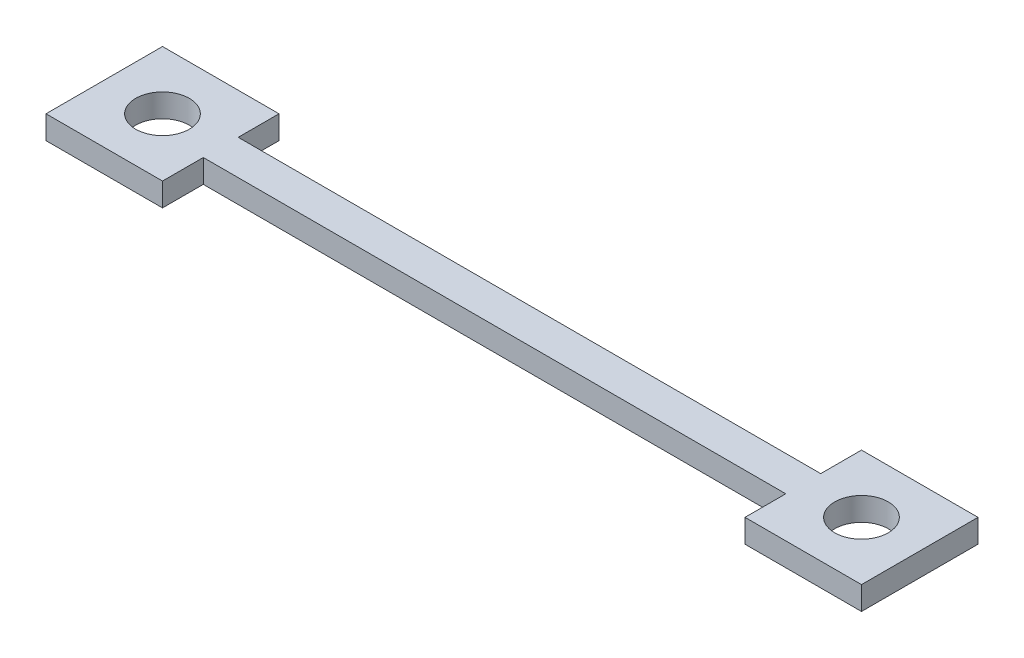
ISO-10303-21;
HEADER;
FILE_DESCRIPTION(('STEP AP214'),'2;1');
FILE_NAME('part.step','',(''),(''),'','','');
FILE_SCHEMA(('AUTOMOTIVE_DESIGN { 1 0 10303 214 1 1 1 1 }'));
ENDSEC;
DATA;
#1=APPLICATION_CONTEXT('core data for automotive mechanical design processes');
#2=APPLICATION_PROTOCOL_DEFINITION('international standard','automotive_design',2000,#1);
#3=PRODUCT_CONTEXT('',#1,'mechanical');
#4=PRODUCT('Part','Part','',(#3));
#5=PRODUCT_RELATED_PRODUCT_CATEGORY('part','',(#4));
#6=PRODUCT_DEFINITION_FORMATION('','',#4);
#7=PRODUCT_DEFINITION_CONTEXT('part definition',#1,'design');
#8=PRODUCT_DEFINITION('design','',#6,#7);
#9=PRODUCT_DEFINITION_SHAPE('','',#8);
#10=(LENGTH_UNIT() NAMED_UNIT(*) SI_UNIT(.MILLI.,.METRE.));
#11=(NAMED_UNIT(*) PLANE_ANGLE_UNIT() SI_UNIT($,.RADIAN.));
#12=(NAMED_UNIT(*) SI_UNIT($,.STERADIAN.) SOLID_ANGLE_UNIT());
#13=UNCERTAINTY_MEASURE_WITH_UNIT(LENGTH_MEASURE(1.E-05),#10,'distance_accuracy_value','');
#14=(GEOMETRIC_REPRESENTATION_CONTEXT(3) GLOBAL_UNCERTAINTY_ASSIGNED_CONTEXT((#13)) GLOBAL_UNIT_ASSIGNED_CONTEXT((#10,
#11,#12)) REPRESENTATION_CONTEXT('',''));
#15=CARTESIAN_POINT('',(0.,0.,0.));
#16=DIRECTION('',(0.,0.,1.));
#17=DIRECTION('',(1.,0.,0.));
#18=AXIS2_PLACEMENT_3D('',#15,#16,#17);
#19=CARTESIAN_POINT('',(-9.67404648456241,0.635,6.15575946530759));
#20=DIRECTION('',(0.,0.,1.));
#21=DIRECTION('',(1.,0.,0.));
#22=AXIS2_PLACEMENT_3D('',#19,#20,#21);
#23=PLANE('',#22);
#24=DIRECTION('',(-1.,0.,0.));
#25=VECTOR('',#24,1.);
#26=CARTESIAN_POINT('',(-9.67404648456241,-0.635,6.15575946530759));
#27=LINE('',#26,#25);
#28=CARTESIAN_POINT('',(-3.32404648456241,-0.635,6.15575946530759));
#29=VERTEX_POINT('',#28);
#30=CARTESIAN_POINT('',(-9.67404648456241,-0.635,6.15575946530759));
#31=VERTEX_POINT('',#30);
#32=EDGE_CURVE('E156',#29,#31,#27,.T.);
#33=ORIENTED_EDGE('',*,*,#32,.T.);
#34=DIRECTION('',(0.,-1.,0.));
#35=VECTOR('',#34,1.);
#36=CARTESIAN_POINT('',(-9.67404648456241,0.635,6.15575946530759));
#37=LINE('',#36,#35);
#38=CARTESIAN_POINT('',(-9.67404648456241,0.635,6.15575946530759));
#39=VERTEX_POINT('',#38);
#40=EDGE_CURVE('E11',#39,#31,#37,.T.);
#41=ORIENTED_EDGE('',*,*,#40,.F.);
#42=DIRECTION('',(-1.,0.,0.));
#43=VECTOR('',#42,1.);
#44=CARTESIAN_POINT('',(-9.67404648456241,0.635,6.15575946530759));
#45=LINE('',#44,#43);
#46=CARTESIAN_POINT('',(-3.32404648456241,0.635,6.15575946530759));
#47=VERTEX_POINT('',#46);
#48=EDGE_CURVE('E179',#47,#39,#45,.T.);
#49=ORIENTED_EDGE('',*,*,#48,.F.);
#50=DIRECTION('',(0.,-1.,0.));
#51=VECTOR('',#50,1.);
#52=CARTESIAN_POINT('',(-3.32404648456241,0.635,6.15575946530759));
#53=LINE('',#52,#51);
#54=EDGE_CURVE('E152',#47,#29,#53,.T.);
#55=ORIENTED_EDGE('',*,*,#54,.T.);
#56=EDGE_LOOP('',(#33,#41,#49,#55));
#57=FACE_BOUND('',#56,.T.);
#58=ADVANCED_FACE('F36',(#57),#23,.F.);
#59=CARTESIAN_POINT('',(-9.67404648456241,0.635,8.37825946530759));
#60=DIRECTION('',(1.,0.,0.));
#61=DIRECTION('',(0.,0.,-1.));
#62=AXIS2_PLACEMENT_3D('',#59,#60,#61);
#63=PLANE('',#62);
#64=DIRECTION('',(0.,0.,1.));
#65=VECTOR('',#64,1.);
#66=CARTESIAN_POINT('',(-9.67404648456241,-0.635,8.37825946530759));
#67=LINE('',#66,#65);
#68=CARTESIAN_POINT('',(-9.67404648456241,-0.635,8.37825946530759));
#69=VERTEX_POINT('',#68);
#70=EDGE_CURVE('E159',#31,#69,#67,.T.);
#71=ORIENTED_EDGE('',*,*,#70,.T.);
#72=DIRECTION('',(0.,-1.,0.));
#73=VECTOR('',#72,1.);
#74=CARTESIAN_POINT('',(-9.67404648456241,0.635,8.37825946530759));
#75=LINE('',#74,#73);
#76=CARTESIAN_POINT('',(-9.67404648456241,0.635,8.37825946530759));
#77=VERTEX_POINT('',#76);
#78=EDGE_CURVE('E44',#77,#69,#75,.T.);
#79=ORIENTED_EDGE('',*,*,#78,.F.);
#80=DIRECTION('',(0.,0.,1.));
#81=VECTOR('',#80,1.);
#82=CARTESIAN_POINT('',(-9.67404648456241,0.635,8.37825946530759));
#83=LINE('',#82,#81);
#84=EDGE_CURVE('E107',#39,#77,#83,.T.);
#85=ORIENTED_EDGE('',*,*,#84,.F.);
#86=ORIENTED_EDGE('',*,*,#40,.T.);
#87=EDGE_LOOP('',(#71,#79,#85,#86));
#88=FACE_BOUND('',#87,.T.);
#89=ADVANCED_FACE('F258',(#88),#63,.F.);
#90=CARTESIAN_POINT('',(-41.4240464845624,0.635,8.37825946530759));
#91=DIRECTION('',(0.,0.,1.));
#92=DIRECTION('',(1.,0.,0.));
#93=AXIS2_PLACEMENT_3D('',#90,#91,#92);
#94=PLANE('',#93);
#95=DIRECTION('',(-1.,0.,0.));
#96=VECTOR('',#95,1.);
#97=CARTESIAN_POINT('',(-41.4240464845624,-0.635,8.37825946530759));
#98=LINE('',#97,#96);
#99=CARTESIAN_POINT('',(-41.4240464845624,-0.635,8.37825946530759));
#100=VERTEX_POINT('',#99);
#101=EDGE_CURVE('E162',#69,#100,#98,.T.);
#102=ORIENTED_EDGE('',*,*,#101,.T.);
#103=DIRECTION('',(0.,-1.,0.));
#104=VECTOR('',#103,1.);
#105=CARTESIAN_POINT('',(-41.4240464845624,0.635,8.37825946530759));
#106=LINE('',#105,#104);
#107=CARTESIAN_POINT('',(-41.4240464845624,0.635,8.37825946530759));
#108=VERTEX_POINT('',#107);
#109=EDGE_CURVE('E198',#108,#100,#106,.T.);
#110=ORIENTED_EDGE('',*,*,#109,.F.);
#111=DIRECTION('',(-1.,0.,0.));
#112=VECTOR('',#111,1.);
#113=CARTESIAN_POINT('',(-41.4240464845624,0.635,8.37825946530759));
#114=LINE('',#113,#112);
#115=EDGE_CURVE('E206',#77,#108,#114,.T.);
#116=ORIENTED_EDGE('',*,*,#115,.F.);
#117=ORIENTED_EDGE('',*,*,#78,.T.);
#118=EDGE_LOOP('',(#102,#110,#116,#117));
#119=FACE_BOUND('',#118,.T.);
#120=ADVANCED_FACE('F204',(#119),#94,.F.);
#121=CARTESIAN_POINT('',(-41.4240464845624,0.635,8.37825946530759));
#122=DIRECTION('',(-1.,0.,0.));
#123=DIRECTION('',(0.,0.,1.));
#124=AXIS2_PLACEMENT_3D('',#121,#122,#123);
#125=PLANE('',#124);
#126=DIRECTION('',(0.,0.,-1.));
#127=VECTOR('',#126,1.);
#128=CARTESIAN_POINT('',(-41.4240464845624,-0.635,8.37825946530759));
#129=LINE('',#128,#127);
#130=CARTESIAN_POINT('',(-41.4240464845624,-0.635,6.15575946530758));
#131=VERTEX_POINT('',#130);
#132=EDGE_CURVE('E164',#100,#131,#129,.T.);
#133=ORIENTED_EDGE('',*,*,#132,.T.);
#134=DIRECTION('',(0.,-1.,0.));
#135=VECTOR('',#134,1.);
#136=CARTESIAN_POINT('',(-41.4240464845624,0.635,6.15575946530758));
#137=LINE('',#136,#135);
#138=CARTESIAN_POINT('',(-41.4240464845624,0.635,6.15575946530758));
#139=VERTEX_POINT('',#138);
#140=EDGE_CURVE('E195',#139,#131,#137,.T.);
#141=ORIENTED_EDGE('',*,*,#140,.F.);
#142=DIRECTION('',(0.,0.,-1.));
#143=VECTOR('',#142,1.);
#144=CARTESIAN_POINT('',(-41.4240464845624,0.635,8.37825946530759));
#145=LINE('',#144,#143);
#146=EDGE_CURVE('E224',#108,#139,#145,.T.);
#147=ORIENTED_EDGE('',*,*,#146,.F.);
#148=ORIENTED_EDGE('',*,*,#109,.T.);
#149=EDGE_LOOP('',(#133,#141,#147,#148));
#150=FACE_BOUND('',#149,.T.);
#151=ADVANCED_FACE('F215',(#150),#125,.F.);
#152=CARTESIAN_POINT('',(-47.7740464845624,0.635,6.15575946530758));
#153=DIRECTION('',(0.,0.,1.));
#154=DIRECTION('',(1.,0.,0.));
#155=AXIS2_PLACEMENT_3D('',#152,#153,#154);
#156=PLANE('',#155);
#157=DIRECTION('',(-1.,0.,0.));
#158=VECTOR('',#157,1.);
#159=CARTESIAN_POINT('',(-47.7740464845624,-0.635,6.15575946530758));
#160=LINE('',#159,#158);
#161=CARTESIAN_POINT('',(-47.7740464845624,-0.635,6.15575946530758));
#162=VERTEX_POINT('',#161);
#163=EDGE_CURVE('E166',#131,#162,#160,.T.);
#164=ORIENTED_EDGE('',*,*,#163,.T.);
#165=DIRECTION('',(0.,-1.,0.));
#166=VECTOR('',#165,1.);
#167=CARTESIAN_POINT('',(-47.7740464845624,0.635,6.15575946530758));
#168=LINE('',#167,#166);
#169=CARTESIAN_POINT('',(-47.7740464845624,0.635,6.15575946530758));
#170=VERTEX_POINT('',#169);
#171=EDGE_CURVE('E192',#170,#162,#168,.T.);
#172=ORIENTED_EDGE('',*,*,#171,.F.);
#173=DIRECTION('',(-1.,0.,0.));
#174=VECTOR('',#173,1.);
#175=CARTESIAN_POINT('',(-47.7740464845624,0.635,6.15575946530758));
#176=LINE('',#175,#174);
#177=EDGE_CURVE('E221',#139,#170,#176,.T.);
#178=ORIENTED_EDGE('',*,*,#177,.F.);
#179=ORIENTED_EDGE('',*,*,#140,.T.);
#180=EDGE_LOOP('',(#164,#172,#178,#179));
#181=FACE_BOUND('',#180,.T.);
#182=ADVANCED_FACE('F219',(#181),#156,.F.);
#183=CARTESIAN_POINT('',(-47.7740464845624,0.635,12.5057594653076));
#184=DIRECTION('',(1.,0.,0.));
#185=DIRECTION('',(0.,0.,-1.));
#186=AXIS2_PLACEMENT_3D('',#183,#184,#185);
#187=PLANE('',#186);
#188=DIRECTION('',(0.,0.,1.));
#189=VECTOR('',#188,1.);
#190=CARTESIAN_POINT('',(-47.7740464845624,-0.635,12.5057594653076));
#191=LINE('',#190,#189);
#192=CARTESIAN_POINT('',(-47.7740464845624,-0.635,12.5057594653076));
#193=VERTEX_POINT('',#192);
#194=EDGE_CURVE('E168',#162,#193,#191,.T.);
#195=ORIENTED_EDGE('',*,*,#194,.T.);
#196=DIRECTION('',(0.,-1.,0.));
#197=VECTOR('',#196,1.);
#198=CARTESIAN_POINT('',(-47.7740464845624,0.635,12.5057594653076));
#199=LINE('',#198,#197);
#200=CARTESIAN_POINT('',(-47.7740464845624,0.635,12.5057594653076));
#201=VERTEX_POINT('',#200);
#202=EDGE_CURVE('E189',#201,#193,#199,.T.);
#203=ORIENTED_EDGE('',*,*,#202,.F.);
#204=DIRECTION('',(0.,0.,1.));
#205=VECTOR('',#204,1.);
#206=CARTESIAN_POINT('',(-47.7740464845624,0.635,12.5057594653076));
#207=LINE('',#206,#205);
#208=EDGE_CURVE('E223',#170,#201,#207,.T.);
#209=ORIENTED_EDGE('',*,*,#208,.F.);
#210=ORIENTED_EDGE('',*,*,#171,.T.);
#211=EDGE_LOOP('',(#195,#203,#209,#210));
#212=FACE_BOUND('',#211,.T.);
#213=ADVANCED_FACE('F271',(#212),#187,.F.);
#214=CARTESIAN_POINT('',(-47.7740464845624,0.635,12.5057594653076));
#215=DIRECTION('',(0.,0.,-1.));
#216=DIRECTION('',(-1.,0.,0.));
#217=AXIS2_PLACEMENT_3D('',#214,#215,#216);
#218=PLANE('',#217);
#219=DIRECTION('',(1.,0.,0.));
#220=VECTOR('',#219,1.);
#221=CARTESIAN_POINT('',(-47.7740464845624,-0.635,12.5057594653076));
#222=LINE('',#221,#220);
#223=CARTESIAN_POINT('',(-41.4240464845624,-0.635,12.5057594653076));
#224=VERTEX_POINT('',#223);
#225=EDGE_CURVE('E170',#193,#224,#222,.T.);
#226=ORIENTED_EDGE('',*,*,#225,.T.);
#227=DIRECTION('',(0.,-1.,0.));
#228=VECTOR('',#227,1.);
#229=CARTESIAN_POINT('',(-41.4240464845624,0.635,12.5057594653076));
#230=LINE('',#229,#228);
#231=CARTESIAN_POINT('',(-41.4240464845624,0.635,12.5057594653076));
#232=VERTEX_POINT('',#231);
#233=EDGE_CURVE('E186',#232,#224,#230,.T.);
#234=ORIENTED_EDGE('',*,*,#233,.F.);
#235=DIRECTION('',(1.,0.,0.));
#236=VECTOR('',#235,1.);
#237=CARTESIAN_POINT('',(-47.7740464845624,0.635,12.5057594653076));
#238=LINE('',#237,#236);
#239=EDGE_CURVE('E226',#201,#232,#238,.T.);
#240=ORIENTED_EDGE('',*,*,#239,.F.);
#241=ORIENTED_EDGE('',*,*,#202,.T.);
#242=EDGE_LOOP('',(#226,#234,#240,#241));
#243=FACE_BOUND('',#242,.T.);
#244=ADVANCED_FACE('F274',(#243),#218,.F.);
#245=CARTESIAN_POINT('',(-41.4240464845624,0.635,10.2832594653076));
#246=DIRECTION('',(-1.,0.,0.));
#247=DIRECTION('',(0.,0.,1.));
#248=AXIS2_PLACEMENT_3D('',#245,#246,#247);
#249=PLANE('',#248);
#250=DIRECTION('',(0.,0.,-1.));
#251=VECTOR('',#250,1.);
#252=CARTESIAN_POINT('',(-41.4240464845624,-0.635,10.2832594653076));
#253=LINE('',#252,#251);
#254=CARTESIAN_POINT('',(-41.4240464845624,-0.635,10.2832594653076));
#255=VERTEX_POINT('',#254);
#256=EDGE_CURVE('E172',#224,#255,#253,.T.);
#257=ORIENTED_EDGE('',*,*,#256,.T.);
#258=DIRECTION('',(0.,-1.,0.));
#259=VECTOR('',#258,1.);
#260=CARTESIAN_POINT('',(-41.4240464845624,0.635,10.2832594653076));
#261=LINE('',#260,#259);
#262=CARTESIAN_POINT('',(-41.4240464845624,0.635,10.2832594653076));
#263=VERTEX_POINT('',#262);
#264=EDGE_CURVE('E183',#263,#255,#261,.T.);
#265=ORIENTED_EDGE('',*,*,#264,.F.);
#266=DIRECTION('',(0.,0.,-1.));
#267=VECTOR('',#266,1.);
#268=CARTESIAN_POINT('',(-41.4240464845624,0.635,10.2832594653076));
#269=LINE('',#268,#267);
#270=EDGE_CURVE('E232',#232,#263,#269,.T.);
#271=ORIENTED_EDGE('',*,*,#270,.F.);
#272=ORIENTED_EDGE('',*,*,#233,.T.);
#273=EDGE_LOOP('',(#257,#265,#271,#272));
#274=FACE_BOUND('',#273,.T.);
#275=ADVANCED_FACE('F238',(#274),#249,.F.);
#276=CARTESIAN_POINT('',(-41.4240464845624,0.635,10.2832594653076));
#277=DIRECTION('',(0.,0.,-1.));
#278=DIRECTION('',(-1.,0.,0.));
#279=AXIS2_PLACEMENT_3D('',#276,#277,#278);
#280=PLANE('',#279);
#281=DIRECTION('',(1.,0.,0.));
#282=VECTOR('',#281,1.);
#283=CARTESIAN_POINT('',(-41.4240464845624,-0.635,10.2832594653076));
#284=LINE('',#283,#282);
#285=CARTESIAN_POINT('',(-9.67404648456241,-0.635,10.2832594653076));
#286=VERTEX_POINT('',#285);
#287=EDGE_CURVE('E174',#255,#286,#284,.T.);
#288=ORIENTED_EDGE('',*,*,#287,.T.);
#289=DIRECTION('',(0.,-1.,0.));
#290=VECTOR('',#289,1.);
#291=CARTESIAN_POINT('',(-9.67404648456241,0.635,10.2832594653076));
#292=LINE('',#291,#290);
#293=CARTESIAN_POINT('',(-9.67404648456241,0.635,10.2832594653076));
#294=VERTEX_POINT('',#293);
#295=EDGE_CURVE('E147',#294,#286,#292,.T.);
#296=ORIENTED_EDGE('',*,*,#295,.F.);
#297=DIRECTION('',(1.,0.,0.));
#298=VECTOR('',#297,1.);
#299=CARTESIAN_POINT('',(-41.4240464845624,0.635,10.2832594653076));
#300=LINE('',#299,#298);
#301=EDGE_CURVE('E138',#263,#294,#300,.T.);
#302=ORIENTED_EDGE('',*,*,#301,.F.);
#303=ORIENTED_EDGE('',*,*,#264,.T.);
#304=EDGE_LOOP('',(#288,#296,#302,#303));
#305=FACE_BOUND('',#304,.T.);
#306=ADVANCED_FACE('F242',(#305),#280,.F.);
#307=CARTESIAN_POINT('',(-9.67404648456241,0.635,10.2832594653076));
#308=DIRECTION('',(1.,0.,0.));
#309=DIRECTION('',(0.,0.,-1.));
#310=AXIS2_PLACEMENT_3D('',#307,#308,#309);
#311=PLANE('',#310);
#312=DIRECTION('',(0.,0.,1.));
#313=VECTOR('',#312,1.);
#314=CARTESIAN_POINT('',(-9.67404648456241,-0.635,10.2832594653076));
#315=LINE('',#314,#313);
#316=CARTESIAN_POINT('',(-9.67404648456241,-0.635,12.5057594653076));
#317=VERTEX_POINT('',#316);
#318=EDGE_CURVE('E146',#286,#317,#315,.T.);
#319=ORIENTED_EDGE('',*,*,#318,.T.);
#320=DIRECTION('',(0.,-1.,0.));
#321=VECTOR('',#320,1.);
#322=CARTESIAN_POINT('',(-9.67404648456241,0.635,12.5057594653076));
#323=LINE('',#322,#321);
#324=CARTESIAN_POINT('',(-9.67404648456241,0.635,12.5057594653076));
#325=VERTEX_POINT('',#324);
#326=EDGE_CURVE('E143',#325,#317,#323,.T.);
#327=ORIENTED_EDGE('',*,*,#326,.F.);
#328=DIRECTION('',(0.,0.,1.));
#329=VECTOR('',#328,1.);
#330=CARTESIAN_POINT('',(-9.67404648456241,0.635,10.2832594653076));
#331=LINE('',#330,#329);
#332=EDGE_CURVE('E132',#294,#325,#331,.T.);
#333=ORIENTED_EDGE('',*,*,#332,.F.);
#334=ORIENTED_EDGE('',*,*,#295,.T.);
#335=EDGE_LOOP('',(#319,#327,#333,#334));
#336=FACE_BOUND('',#335,.T.);
#337=ADVANCED_FACE('F144',(#336),#311,.F.);
#338=CARTESIAN_POINT('',(-9.67404648456241,0.635,12.5057594653076));
#339=DIRECTION('',(0.,0.,-1.));
#340=DIRECTION('',(-1.,0.,0.));
#341=AXIS2_PLACEMENT_3D('',#338,#339,#340);
#342=PLANE('',#341);
#343=DIRECTION('',(1.,0.,0.));
#344=VECTOR('',#343,1.);
#345=CARTESIAN_POINT('',(-9.67404648456241,-0.635,12.5057594653076));
#346=LINE('',#345,#344);
#347=CARTESIAN_POINT('',(-3.32404648456241,-0.635,12.5057594653076));
#348=VERTEX_POINT('',#347);
#349=EDGE_CURVE('E93',#317,#348,#346,.T.);
#350=ORIENTED_EDGE('',*,*,#349,.T.);
#351=DIRECTION('',(0.,-1.,0.));
#352=VECTOR('',#351,1.);
#353=CARTESIAN_POINT('',(-3.32404648456241,0.635,12.5057594653076));
#354=LINE('',#353,#352);
#355=CARTESIAN_POINT('',(-3.32404648456241,0.635,12.5057594653076));
#356=VERTEX_POINT('',#355);
#357=EDGE_CURVE('E148',#356,#348,#354,.T.);
#358=ORIENTED_EDGE('',*,*,#357,.F.);
#359=DIRECTION('',(1.,0.,0.));
#360=VECTOR('',#359,1.);
#361=CARTESIAN_POINT('',(-9.67404648456241,0.635,12.5057594653076));
#362=LINE('',#361,#360);
#363=EDGE_CURVE('E136',#325,#356,#362,.T.);
#364=ORIENTED_EDGE('',*,*,#363,.F.);
#365=ORIENTED_EDGE('',*,*,#326,.T.);
#366=EDGE_LOOP('',(#350,#358,#364,#365));
#367=FACE_BOUND('',#366,.T.);
#368=ADVANCED_FACE('F150',(#367),#342,.F.);
#369=CARTESIAN_POINT('',(-3.32404648456241,0.635,12.5057594653076));
#370=DIRECTION('',(-1.,0.,0.));
#371=DIRECTION('',(0.,0.,1.));
#372=AXIS2_PLACEMENT_3D('',#369,#370,#371);
#373=PLANE('',#372);
#374=DIRECTION('',(0.,0.,-1.));
#375=VECTOR('',#374,1.);
#376=CARTESIAN_POINT('',(-3.32404648456241,-0.635,12.5057594653076));
#377=LINE('',#376,#375);
#378=EDGE_CURVE('E99',#348,#29,#377,.T.);
#379=ORIENTED_EDGE('',*,*,#378,.T.);
#380=ORIENTED_EDGE('',*,*,#54,.F.);
#381=DIRECTION('',(0.,0.,-1.));
#382=VECTOR('',#381,1.);
#383=CARTESIAN_POINT('',(-3.32404648456241,0.635,12.5057594653076));
#384=LINE('',#383,#382);
#385=EDGE_CURVE('E52',#356,#47,#384,.T.);
#386=ORIENTED_EDGE('',*,*,#385,.F.);
#387=ORIENTED_EDGE('',*,*,#357,.T.);
#388=EDGE_LOOP('',(#379,#380,#386,#387));
#389=FACE_BOUND('',#388,.T.);
#390=ADVANCED_FACE('F246',(#389),#373,.F.);
#391=CARTESIAN_POINT('',(-3.32404648456241,0.635,6.15575946530759));
#392=DIRECTION('',(0.,1.,0.));
#393=DIRECTION('',(0.,0.,1.));
#394=AXIS2_PLACEMENT_3D('',#391,#392,#393);
#395=PLANE('',#394);
#396=CARTESIAN_POINT('',(-6.49904648456241,0.635,9.33075946530758));
#397=DIRECTION('',(0.,1.,0.));
#398=DIRECTION('',(0.,0.,1.));
#399=AXIS2_PLACEMENT_3D('',#396,#397,#398);
#400=CIRCLE('',#399,1.4605);
#401=CARTESIAN_POINT('',(-6.49904648456241,0.635,10.7912594653076));
#402=VERTEX_POINT('',#401);
#403=EDGE_CURVE('E340',#402,#402,#400,.T.);
#404=ORIENTED_EDGE('',*,*,#403,.F.);
#405=EDGE_LOOP('',(#404));
#406=FACE_BOUND('',#405,.T.);
#407=CARTESIAN_POINT('',(-44.5990464845624,0.635,9.33075946530758));
#408=DIRECTION('',(0.,1.,0.));
#409=DIRECTION('',(0.,0.,1.));
#410=AXIS2_PLACEMENT_3D('',#407,#408,#409);
#411=CIRCLE('',#410,1.4605);
#412=CARTESIAN_POINT('',(-44.5990464845624,0.635,10.7912594653076));
#413=VERTEX_POINT('',#412);
#414=EDGE_CURVE('E342',#413,#413,#411,.T.);
#415=ORIENTED_EDGE('',*,*,#414,.F.);
#416=EDGE_LOOP('',(#415));
#417=FACE_BOUND('',#416,.T.);
#418=ORIENTED_EDGE('',*,*,#48,.T.);
#419=ORIENTED_EDGE('',*,*,#84,.T.);
#420=ORIENTED_EDGE('',*,*,#115,.T.);
#421=ORIENTED_EDGE('',*,*,#146,.T.);
#422=ORIENTED_EDGE('',*,*,#177,.T.);
#423=ORIENTED_EDGE('',*,*,#208,.T.);
#424=ORIENTED_EDGE('',*,*,#239,.T.);
#425=ORIENTED_EDGE('',*,*,#270,.T.);
#426=ORIENTED_EDGE('',*,*,#301,.T.);
#427=ORIENTED_EDGE('',*,*,#332,.T.);
#428=ORIENTED_EDGE('',*,*,#363,.T.);
#429=ORIENTED_EDGE('',*,*,#385,.T.);
#430=EDGE_LOOP('',(#418,#419,#420,#421,#422,#423,#424,#425,#426,#427,#428,#429));
#431=FACE_BOUND('',#430,.T.);
#432=ADVANCED_FACE('F134',(#406,#417,#431),#395,.T.);
#433=CARTESIAN_POINT('',(-3.32404648456241,-0.635,6.15575946530759));
#434=DIRECTION('',(0.,1.,0.));
#435=DIRECTION('',(0.,0.,1.));
#436=AXIS2_PLACEMENT_3D('',#433,#434,#435);
#437=PLANE('',#436);
#438=CARTESIAN_POINT('',(-6.49904648456241,-0.635,9.33075946530758));
#439=DIRECTION('',(0.,1.,0.));
#440=DIRECTION('',(0.,0.,1.));
#441=AXIS2_PLACEMENT_3D('',#438,#439,#440);
#442=CIRCLE('',#441,1.4605);
#443=CARTESIAN_POINT('',(-6.49904648456241,-0.635,10.7912594653076));
#444=VERTEX_POINT('',#443);
#445=EDGE_CURVE('E337',#444,#444,#442,.T.);
#446=ORIENTED_EDGE('',*,*,#445,.T.);
#447=EDGE_LOOP('',(#446));
#448=FACE_BOUND('',#447,.T.);
#449=CARTESIAN_POINT('',(-44.5990464845624,-0.635,9.33075946530758));
#450=DIRECTION('',(0.,1.,0.));
#451=DIRECTION('',(0.,0.,1.));
#452=AXIS2_PLACEMENT_3D('',#449,#450,#451);
#453=CIRCLE('',#452,1.4605);
#454=CARTESIAN_POINT('',(-44.5990464845624,-0.635,10.7912594653076));
#455=VERTEX_POINT('',#454);
#456=EDGE_CURVE('E160',#455,#455,#453,.T.);
#457=ORIENTED_EDGE('',*,*,#456,.T.);
#458=EDGE_LOOP('',(#457));
#459=FACE_BOUND('',#458,.T.);
#460=ORIENTED_EDGE('',*,*,#32,.F.);
#461=ORIENTED_EDGE('',*,*,#378,.F.);
#462=ORIENTED_EDGE('',*,*,#349,.F.);
#463=ORIENTED_EDGE('',*,*,#318,.F.);
#464=ORIENTED_EDGE('',*,*,#287,.F.);
#465=ORIENTED_EDGE('',*,*,#256,.F.);
#466=ORIENTED_EDGE('',*,*,#225,.F.);
#467=ORIENTED_EDGE('',*,*,#194,.F.);
#468=ORIENTED_EDGE('',*,*,#163,.F.);
#469=ORIENTED_EDGE('',*,*,#132,.F.);
#470=ORIENTED_EDGE('',*,*,#101,.F.);
#471=ORIENTED_EDGE('',*,*,#70,.F.);
#472=EDGE_LOOP('',(#460,#461,#462,#463,#464,#465,#466,#467,#468,#469,#470,#471));
#473=FACE_BOUND('',#472,.T.);
#474=ADVANCED_FACE('F210',(#448,#459,#473),#437,.F.);
#475=CARTESIAN_POINT('',(-44.5990464845624,0.635,9.33075946530758));
#476=DIRECTION('',(0.,1.,0.));
#477=DIRECTION('',(0.,0.,1.));
#478=AXIS2_PLACEMENT_3D('',#475,#476,#477);
#479=CYLINDRICAL_SURFACE('',#478,1.4605);
#480=ORIENTED_EDGE('',*,*,#456,.F.);
#481=EDGE_LOOP('',(#480));
#482=FACE_BOUND('',#481,.T.);
#483=ORIENTED_EDGE('',*,*,#414,.T.);
#484=EDGE_LOOP('',(#483));
#485=FACE_BOUND('',#484,.T.);
#486=ADVANCED_FACE('F302',(#482,#485),#479,.F.);
#487=CARTESIAN_POINT('',(-6.49904648456241,0.635,9.33075946530758));
#488=DIRECTION('',(0.,1.,0.));
#489=DIRECTION('',(0.,0.,1.));
#490=AXIS2_PLACEMENT_3D('',#487,#488,#489);
#491=CYLINDRICAL_SURFACE('',#490,1.4605);
#492=ORIENTED_EDGE('',*,*,#445,.F.);
#493=EDGE_LOOP('',(#492));
#494=FACE_BOUND('',#493,.T.);
#495=ORIENTED_EDGE('',*,*,#403,.T.);
#496=EDGE_LOOP('',(#495));
#497=FACE_BOUND('',#496,.T.);
#498=ADVANCED_FACE('F307',(#494,#497),#491,.F.);
#499=CLOSED_SHELL('',(#58,#89,#120,#151,#182,#213,#244,#275,#306,#337,#368,#390,#432,#474,#486,#498));
#500=MANIFOLD_SOLID_BREP('B2',#499);
#501=ADVANCED_BREP_SHAPE_REPRESENTATION('',(#18,#500),#14);
#502=SHAPE_DEFINITION_REPRESENTATION(#9,#501);
ENDSEC;
END-ISO-10303-21;
